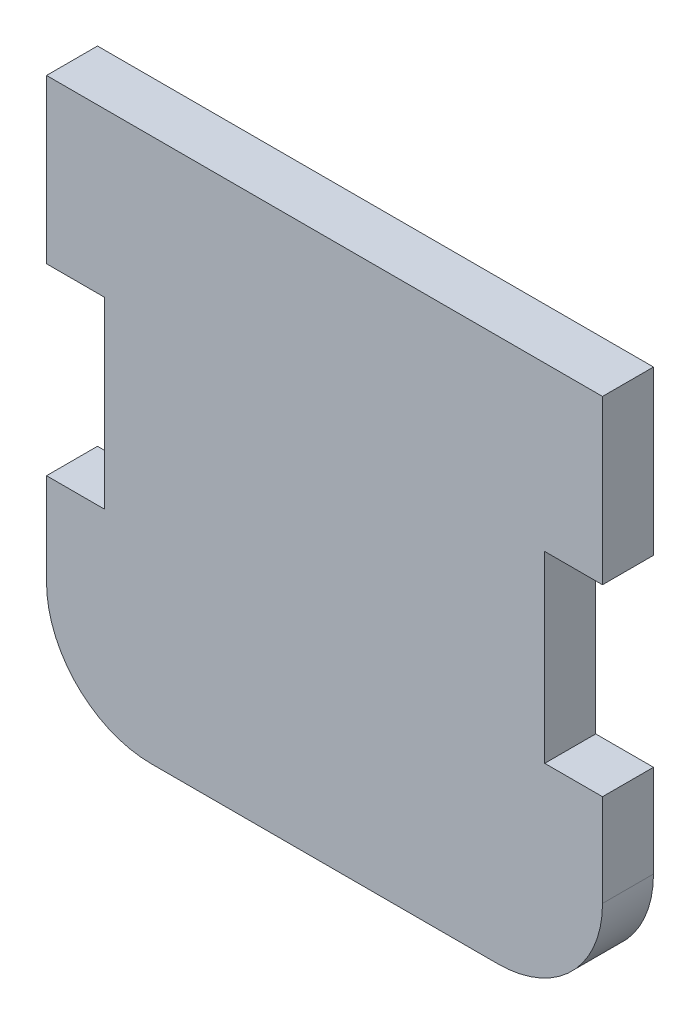
ISO-10303-21;
HEADER;
FILE_DESCRIPTION(('STEP AP214'),'2;1');
FILE_NAME('part.step','',(''),(''),'','','');
FILE_SCHEMA(('AUTOMOTIVE_DESIGN { 1 0 10303 214 1 1 1 1 }'));
ENDSEC;
DATA;
#1=APPLICATION_CONTEXT('core data for automotive mechanical design processes');
#2=APPLICATION_PROTOCOL_DEFINITION('international standard','automotive_design',2000,#1);
#3=PRODUCT_CONTEXT('',#1,'mechanical');
#4=PRODUCT('Part','Part','',(#3));
#5=PRODUCT_RELATED_PRODUCT_CATEGORY('part','',(#4));
#6=PRODUCT_DEFINITION_FORMATION('','',#4);
#7=PRODUCT_DEFINITION_CONTEXT('part definition',#1,'design');
#8=PRODUCT_DEFINITION('design','',#6,#7);
#9=PRODUCT_DEFINITION_SHAPE('','',#8);
#10=(LENGTH_UNIT() NAMED_UNIT(*) SI_UNIT(.MILLI.,.METRE.));
#11=(NAMED_UNIT(*) PLANE_ANGLE_UNIT() SI_UNIT($,.RADIAN.));
#12=(NAMED_UNIT(*) SI_UNIT($,.STERADIAN.) SOLID_ANGLE_UNIT());
#13=UNCERTAINTY_MEASURE_WITH_UNIT(LENGTH_MEASURE(1.E-05),#10,'distance_accuracy_value','');
#14=(GEOMETRIC_REPRESENTATION_CONTEXT(3) GLOBAL_UNCERTAINTY_ASSIGNED_CONTEXT((#13)) GLOBAL_UNIT_ASSIGNED_CONTEXT((#10,
#11,#12)) REPRESENTATION_CONTEXT('',''));
#15=CARTESIAN_POINT('',(0.,0.,0.));
#16=DIRECTION('',(0.,0.,1.));
#17=DIRECTION('',(1.,0.,0.));
#18=AXIS2_PLACEMENT_3D('',#15,#16,#17);
#19=CARTESIAN_POINT('',(-432.2699,-6.09600000000011,1.905));
#20=DIRECTION('',(0.,1.,0.));
#21=DIRECTION('',(-1.,0.,0.));
#22=AXIS2_PLACEMENT_3D('',#19,#20,#21);
#23=PLANE('',#22);
#24=DIRECTION('',(0.,0.,1.));
#25=VECTOR('',#24,1.);
#26=CARTESIAN_POINT('',(-434.6829,-6.09600000000011,1.905));
#27=LINE('',#26,#25);
#28=CARTESIAN_POINT('',(-434.6829,-6.09600000000011,0.));
#29=VERTEX_POINT('',#28);
#30=CARTESIAN_POINT('',(-434.6829,-6.09600000000011,1.905));
#31=VERTEX_POINT('',#30);
#32=EDGE_CURVE('E11',#29,#31,#27,.T.);
#33=ORIENTED_EDGE('',*,*,#32,.F.);
#34=DIRECTION('',(1.,0.,0.));
#35=VECTOR('',#34,1.);
#36=CARTESIAN_POINT('',(-436.4355,-6.09600000000011,0.));
#37=LINE('',#36,#35);
#38=CARTESIAN_POINT('',(-432.5239,-6.09600000000011,0.));
#39=VERTEX_POINT('',#38);
#40=EDGE_CURVE('E136',#39,#29,#37,.F.);
#41=ORIENTED_EDGE('',*,*,#40,.F.);
#42=DIRECTION('',(0.,0.,1.));
#43=VECTOR('',#42,1.);
#44=CARTESIAN_POINT('',(-432.5239,-6.09600000000011,1.905));
#45=LINE('',#44,#43);
#46=CARTESIAN_POINT('',(-432.5239,-6.09600000000011,1.905));
#47=VERTEX_POINT('',#46);
#48=EDGE_CURVE('E60',#39,#47,#45,.T.);
#49=ORIENTED_EDGE('',*,*,#48,.T.);
#50=DIRECTION('',(-1.,0.,0.));
#51=VECTOR('',#50,1.);
#52=CARTESIAN_POINT('',(-432.2699,-6.09600000000011,1.905));
#53=LINE('',#52,#51);
#54=EDGE_CURVE('E240',#47,#31,#53,.T.);
#55=ORIENTED_EDGE('',*,*,#54,.T.);
#56=EDGE_LOOP('',(#33,#41,#49,#55));
#57=FACE_BOUND('',#56,.T.);
#58=ADVANCED_FACE('F49',(#57),#23,.F.);
#59=CARTESIAN_POINT('',(-432.5239,-1.11022302462516E-13,1.905));
#60=DIRECTION('',(-1.,0.,0.));
#61=DIRECTION('',(0.,-1.,0.));
#62=AXIS2_PLACEMENT_3D('',#59,#60,#61);
#63=PLANE('',#62);
#64=ORIENTED_EDGE('',*,*,#48,.F.);
#65=DIRECTION('',(0.,1.,0.));
#66=VECTOR('',#65,1.);
#67=CARTESIAN_POINT('',(-432.5239,-16.4084000000001,0.));
#68=LINE('',#67,#66);
#69=CARTESIAN_POINT('',(-432.5239,-1.11022302462516E-13,0.));
#70=VERTEX_POINT('',#69);
#71=EDGE_CURVE('E188',#70,#39,#68,.F.);
#72=ORIENTED_EDGE('',*,*,#71,.F.);
#73=DIRECTION('',(0.,0.,1.));
#74=VECTOR('',#73,1.);
#75=CARTESIAN_POINT('',(-432.5239,-1.11022302462516E-13,1.905));
#76=LINE('',#75,#74);
#77=CARTESIAN_POINT('',(-432.5239,-1.11022302462516E-13,1.905));
#78=VERTEX_POINT('',#77);
#79=EDGE_CURVE('E229',#70,#78,#76,.T.);
#80=ORIENTED_EDGE('',*,*,#79,.T.);
#81=DIRECTION('',(0.,-1.,0.));
#82=VECTOR('',#81,1.);
#83=CARTESIAN_POINT('',(-432.5239,-1.11022302462516E-13,1.905));
#84=LINE('',#83,#82);
#85=EDGE_CURVE('E250',#78,#47,#84,.T.);
#86=ORIENTED_EDGE('',*,*,#85,.T.);
#87=EDGE_LOOP('',(#64,#72,#80,#86));
#88=FACE_BOUND('',#87,.T.);
#89=ADVANCED_FACE('F254',(#88),#63,.F.);
#90=CARTESIAN_POINT('',(-451.396099999999,-1.11022302462516E-13,1.905));
#91=DIRECTION('',(0.,-1.,0.));
#92=DIRECTION('',(1.,0.,0.));
#93=AXIS2_PLACEMENT_3D('',#90,#91,#92);
#94=PLANE('',#93);
#95=ORIENTED_EDGE('',*,*,#79,.F.);
#96=DIRECTION('',(1.,0.,0.));
#97=VECTOR('',#96,1.);
#98=CARTESIAN_POINT('',(-436.4355,-1.11022302462516E-13,0.));
#99=LINE('',#98,#97);
#100=CARTESIAN_POINT('',(-453.301099999999,-1.11022302462516E-13,0.));
#101=VERTEX_POINT('',#100);
#102=EDGE_CURVE('E184',#101,#70,#99,.T.);
#103=ORIENTED_EDGE('',*,*,#102,.F.);
#104=DIRECTION('',(0.,0.,1.));
#105=VECTOR('',#104,1.);
#106=CARTESIAN_POINT('',(-453.301099999999,-1.11022302462516E-13,1.905));
#107=LINE('',#106,#105);
#108=CARTESIAN_POINT('',(-453.301099999999,-1.11022302462516E-13,1.905));
#109=VERTEX_POINT('',#108);
#110=EDGE_CURVE('E225',#101,#109,#107,.T.);
#111=ORIENTED_EDGE('',*,*,#110,.T.);
#112=DIRECTION('',(1.,0.,0.));
#113=VECTOR('',#112,1.);
#114=CARTESIAN_POINT('',(-451.396099999999,-1.11022302462516E-13,1.905));
#115=LINE('',#114,#113);
#116=EDGE_CURVE('E256',#109,#78,#115,.T.);
#117=ORIENTED_EDGE('',*,*,#116,.T.);
#118=EDGE_LOOP('',(#95,#103,#111,#117));
#119=FACE_BOUND('',#118,.T.);
#120=ADVANCED_FACE('F334',(#119),#94,.F.);
#121=CARTESIAN_POINT('',(-453.301099999999,-16.4084000000001,1.905));
#122=DIRECTION('',(1.,0.,0.));
#123=DIRECTION('',(0.,1.,0.));
#124=AXIS2_PLACEMENT_3D('',#121,#122,#123);
#125=PLANE('',#124);
#126=ORIENTED_EDGE('',*,*,#110,.F.);
#127=DIRECTION('',(0.,1.,0.));
#128=VECTOR('',#127,1.);
#129=CARTESIAN_POINT('',(-453.301099999999,-16.4084000000001,0.));
#130=LINE('',#129,#128);
#131=CARTESIAN_POINT('',(-453.301099999999,-6.09600000000011,0.));
#132=VERTEX_POINT('',#131);
#133=EDGE_CURVE('E180',#132,#101,#130,.T.);
#134=ORIENTED_EDGE('',*,*,#133,.F.);
#135=DIRECTION('',(0.,0.,1.));
#136=VECTOR('',#135,1.);
#137=CARTESIAN_POINT('',(-453.301099999999,-6.09600000000011,1.905));
#138=LINE('',#137,#136);
#139=CARTESIAN_POINT('',(-453.301099999999,-6.09600000000011,1.905));
#140=VERTEX_POINT('',#139);
#141=EDGE_CURVE('E221',#132,#140,#138,.T.);
#142=ORIENTED_EDGE('',*,*,#141,.T.);
#143=DIRECTION('',(0.,1.,0.));
#144=VECTOR('',#143,1.);
#145=CARTESIAN_POINT('',(-453.301099999999,-16.4084000000001,1.905));
#146=LINE('',#145,#144);
#147=EDGE_CURVE('E260',#140,#109,#146,.T.);
#148=ORIENTED_EDGE('',*,*,#147,.T.);
#149=EDGE_LOOP('',(#126,#134,#142,#148));
#150=FACE_BOUND('',#149,.T.);
#151=ADVANCED_FACE('F352',(#150),#125,.F.);
#152=CARTESIAN_POINT('',(-453.555099999999,-6.09600000000011,1.905));
#153=DIRECTION('',(0.,1.,0.));
#154=DIRECTION('',(-1.,0.,0.));
#155=AXIS2_PLACEMENT_3D('',#152,#153,#154);
#156=PLANE('',#155);
#157=ORIENTED_EDGE('',*,*,#141,.F.);
#158=DIRECTION('',(1.,0.,0.));
#159=VECTOR('',#158,1.);
#160=CARTESIAN_POINT('',(-436.4355,-6.09600000000011,0.));
#161=LINE('',#160,#159);
#162=CARTESIAN_POINT('',(-451.142099999999,-6.09600000000011,0.));
#163=VERTEX_POINT('',#162);
#164=EDGE_CURVE('E176',#163,#132,#161,.F.);
#165=ORIENTED_EDGE('',*,*,#164,.F.);
#166=DIRECTION('',(0.,0.,1.));
#167=VECTOR('',#166,1.);
#168=CARTESIAN_POINT('',(-451.142099999999,-6.09600000000011,1.905));
#169=LINE('',#168,#167);
#170=CARTESIAN_POINT('',(-451.142099999999,-6.09600000000011,1.905));
#171=VERTEX_POINT('',#170);
#172=EDGE_CURVE('E217',#163,#171,#169,.T.);
#173=ORIENTED_EDGE('',*,*,#172,.T.);
#174=DIRECTION('',(-1.,0.,0.));
#175=VECTOR('',#174,1.);
#176=CARTESIAN_POINT('',(-453.555099999999,-6.09600000000011,1.905));
#177=LINE('',#176,#175);
#178=EDGE_CURVE('E289',#171,#140,#177,.T.);
#179=ORIENTED_EDGE('',*,*,#178,.T.);
#180=EDGE_LOOP('',(#157,#165,#173,#179));
#181=FACE_BOUND('',#180,.T.);
#182=ADVANCED_FACE('F338',(#181),#156,.F.);
#183=CARTESIAN_POINT('',(-451.142099999999,-12.9540000000001,1.905));
#184=DIRECTION('',(1.,0.,0.));
#185=DIRECTION('',(0.,1.,0.));
#186=AXIS2_PLACEMENT_3D('',#183,#184,#185);
#187=PLANE('',#186);
#188=ORIENTED_EDGE('',*,*,#172,.F.);
#189=DIRECTION('',(0.,1.,0.));
#190=VECTOR('',#189,1.);
#191=CARTESIAN_POINT('',(-451.142099999999,-16.4084000000001,0.));
#192=LINE('',#191,#190);
#193=CARTESIAN_POINT('',(-451.142099999999,-12.9540000000001,0.));
#194=VERTEX_POINT('',#193);
#195=EDGE_CURVE('E172',#194,#163,#192,.T.);
#196=ORIENTED_EDGE('',*,*,#195,.F.);
#197=DIRECTION('',(0.,0.,1.));
#198=VECTOR('',#197,1.);
#199=CARTESIAN_POINT('',(-451.142099999999,-12.9540000000001,1.905));
#200=LINE('',#199,#198);
#201=CARTESIAN_POINT('',(-451.142099999999,-12.9540000000001,1.905));
#202=VERTEX_POINT('',#201);
#203=EDGE_CURVE('E213',#194,#202,#200,.T.);
#204=ORIENTED_EDGE('',*,*,#203,.T.);
#205=DIRECTION('',(0.,1.,0.));
#206=VECTOR('',#205,1.);
#207=CARTESIAN_POINT('',(-451.142099999999,-12.9540000000001,1.905));
#208=LINE('',#207,#206);
#209=EDGE_CURVE('E285',#202,#171,#208,.T.);
#210=ORIENTED_EDGE('',*,*,#209,.T.);
#211=EDGE_LOOP('',(#188,#196,#204,#210));
#212=FACE_BOUND('',#211,.T.);
#213=ADVANCED_FACE('F342',(#212),#187,.F.);
#214=CARTESIAN_POINT('',(-453.555099999999,-12.9540000000001,1.905));
#215=DIRECTION('',(0.,-1.,0.));
#216=DIRECTION('',(1.,0.,0.));
#217=AXIS2_PLACEMENT_3D('',#214,#215,#216);
#218=PLANE('',#217);
#219=ORIENTED_EDGE('',*,*,#203,.F.);
#220=DIRECTION('',(1.,0.,0.));
#221=VECTOR('',#220,1.);
#222=CARTESIAN_POINT('',(-436.4355,-12.9540000000001,0.));
#223=LINE('',#222,#221);
#224=CARTESIAN_POINT('',(-453.301099999999,-12.9540000000001,0.));
#225=VERTEX_POINT('',#224);
#226=EDGE_CURVE('E168',#225,#194,#223,.T.);
#227=ORIENTED_EDGE('',*,*,#226,.F.);
#228=DIRECTION('',(0.,0.,1.));
#229=VECTOR('',#228,1.);
#230=CARTESIAN_POINT('',(-453.301099999999,-12.9540000000001,1.905));
#231=LINE('',#230,#229);
#232=CARTESIAN_POINT('',(-453.301099999999,-12.9540000000001,1.905));
#233=VERTEX_POINT('',#232);
#234=EDGE_CURVE('E209',#225,#233,#231,.T.);
#235=ORIENTED_EDGE('',*,*,#234,.T.);
#236=DIRECTION('',(1.,0.,0.));
#237=VECTOR('',#236,1.);
#238=CARTESIAN_POINT('',(-453.555099999999,-12.9540000000001,1.905));
#239=LINE('',#238,#237);
#240=EDGE_CURVE('E281',#233,#202,#239,.T.);
#241=ORIENTED_EDGE('',*,*,#240,.T.);
#242=EDGE_LOOP('',(#219,#227,#235,#241));
#243=FACE_BOUND('',#242,.T.);
#244=ADVANCED_FACE('F345',(#243),#218,.F.);
#245=ORIENTED_EDGE('',*,*,#234,.F.);
#246=DIRECTION('',(0.,1.,0.));
#247=VECTOR('',#246,1.);
#248=CARTESIAN_POINT('',(-453.301099999999,-16.4084000000001,0.));
#249=LINE('',#248,#247);
#250=CARTESIAN_POINT('',(-453.301099999999,-16.4084000000001,0.));
#251=VERTEX_POINT('',#250);
#252=EDGE_CURVE('E164',#251,#225,#249,.T.);
#253=ORIENTED_EDGE('',*,*,#252,.F.);
#254=DIRECTION('',(0.,0.,1.));
#255=VECTOR('',#254,1.);
#256=CARTESIAN_POINT('',(-453.301099999999,-16.4084000000001,1.905));
#257=LINE('',#256,#255);
#258=CARTESIAN_POINT('',(-453.301099999999,-16.4084000000001,1.905));
#259=VERTEX_POINT('',#258);
#260=EDGE_CURVE('E205',#251,#259,#257,.T.);
#261=ORIENTED_EDGE('',*,*,#260,.T.);
#262=EDGE_CURVE('E278',#259,#233,#146,.T.);
#263=ORIENTED_EDGE('',*,*,#262,.T.);
#264=EDGE_LOOP('',(#245,#253,#261,#263));
#265=FACE_BOUND('',#264,.T.);
#266=ADVANCED_FACE('F305',(#265),#125,.F.);
#267=CARTESIAN_POINT('',(-449.389499999999,-16.4084000000001,1.905));
#268=DIRECTION('',(0.,0.,1.));
#269=DIRECTION('',(1.,0.,0.));
#270=AXIS2_PLACEMENT_3D('',#267,#268,#269);
#271=CYLINDRICAL_SURFACE('',#270,3.91160000000002);
#272=ORIENTED_EDGE('',*,*,#260,.F.);
#273=CARTESIAN_POINT('',(-449.389499999999,-16.4084000000001,0.));
#274=DIRECTION('',(0.,0.,1.));
#275=DIRECTION('',(1.,0.,0.));
#276=AXIS2_PLACEMENT_3D('',#273,#274,#275);
#277=CIRCLE('',#276,3.91160000000002);
#278=CARTESIAN_POINT('',(-449.389499999999,-20.3200000000001,0.));
#279=VERTEX_POINT('',#278);
#280=EDGE_CURVE('E160',#251,#279,#277,.T.);
#281=ORIENTED_EDGE('',*,*,#280,.T.);
#282=DIRECTION('',(0.,0.,1.));
#283=VECTOR('',#282,1.);
#284=CARTESIAN_POINT('',(-449.389499999999,-20.3200000000001,1.905));
#285=LINE('',#284,#283);
#286=CARTESIAN_POINT('',(-449.389499999999,-20.3200000000001,1.905));
#287=VERTEX_POINT('',#286);
#288=EDGE_CURVE('E201',#279,#287,#285,.T.);
#289=ORIENTED_EDGE('',*,*,#288,.T.);
#290=CARTESIAN_POINT('',(-449.389499999999,-16.4084000000001,1.905));
#291=DIRECTION('',(0.,0.,1.));
#292=DIRECTION('',(1.,0.,0.));
#293=AXIS2_PLACEMENT_3D('',#290,#291,#292);
#294=CIRCLE('',#293,3.91160000000002);
#295=EDGE_CURVE('E272',#259,#287,#294,.T.);
#296=ORIENTED_EDGE('',*,*,#295,.F.);
#297=EDGE_LOOP('',(#272,#281,#289,#296));
#298=FACE_BOUND('',#297,.T.);
#299=ADVANCED_FACE('F315',(#298),#271,.T.);
#300=CARTESIAN_POINT('',(-436.4355,-20.3200000000001,1.905));
#301=DIRECTION('',(0.,1.,0.));
#302=DIRECTION('',(-1.,0.,0.));
#303=AXIS2_PLACEMENT_3D('',#300,#301,#302);
#304=PLANE('',#303);
#305=ORIENTED_EDGE('',*,*,#288,.F.);
#306=DIRECTION('',(1.,0.,0.));
#307=VECTOR('',#306,1.);
#308=CARTESIAN_POINT('',(-436.4355,-20.3200000000001,0.));
#309=LINE('',#308,#307);
#310=CARTESIAN_POINT('',(-436.4355,-20.3200000000001,0.));
#311=VERTEX_POINT('',#310);
#312=EDGE_CURVE('E156',#311,#279,#309,.F.);
#313=ORIENTED_EDGE('',*,*,#312,.F.);
#314=DIRECTION('',(0.,0.,1.));
#315=VECTOR('',#314,1.);
#316=CARTESIAN_POINT('',(-436.4355,-20.3200000000001,1.905));
#317=LINE('',#316,#315);
#318=CARTESIAN_POINT('',(-436.4355,-20.3200000000001,1.905));
#319=VERTEX_POINT('',#318);
#320=EDGE_CURVE('E197',#311,#319,#317,.T.);
#321=ORIENTED_EDGE('',*,*,#320,.T.);
#322=DIRECTION('',(-1.,0.,0.));
#323=VECTOR('',#322,1.);
#324=CARTESIAN_POINT('',(-436.4355,-20.3200000000001,1.905));
#325=LINE('',#324,#323);
#326=EDGE_CURVE('E267',#319,#287,#325,.T.);
#327=ORIENTED_EDGE('',*,*,#326,.T.);
#328=EDGE_LOOP('',(#305,#313,#321,#327));
#329=FACE_BOUND('',#328,.T.);
#330=ADVANCED_FACE('F319',(#329),#304,.F.);
#331=CARTESIAN_POINT('',(-436.4355,-16.4084000000001,1.905));
#332=DIRECTION('',(0.,0.,1.));
#333=DIRECTION('',(1.,0.,0.));
#334=AXIS2_PLACEMENT_3D('',#331,#332,#333);
#335=CYLINDRICAL_SURFACE('',#334,3.91160000000002);
#336=ORIENTED_EDGE('',*,*,#320,.F.);
#337=CARTESIAN_POINT('',(-436.4355,-16.4084000000001,0.));
#338=DIRECTION('',(0.,0.,1.));
#339=DIRECTION('',(1.,0.,0.));
#340=AXIS2_PLACEMENT_3D('',#337,#338,#339);
#341=CIRCLE('',#340,3.91160000000002);
#342=CARTESIAN_POINT('',(-432.5239,-16.4084000000001,0.));
#343=VERTEX_POINT('',#342);
#344=EDGE_CURVE('E152',#311,#343,#341,.T.);
#345=ORIENTED_EDGE('',*,*,#344,.T.);
#346=DIRECTION('',(0.,0.,1.));
#347=VECTOR('',#346,1.);
#348=CARTESIAN_POINT('',(-432.5239,-16.4084000000001,1.905));
#349=LINE('',#348,#347);
#350=CARTESIAN_POINT('',(-432.5239,-16.4084000000001,1.905));
#351=VERTEX_POINT('',#350);
#352=EDGE_CURVE('E194',#343,#351,#349,.T.);
#353=ORIENTED_EDGE('',*,*,#352,.T.);
#354=CARTESIAN_POINT('',(-436.4355,-16.4084000000001,1.905));
#355=DIRECTION('',(0.,0.,1.));
#356=DIRECTION('',(1.,0.,0.));
#357=AXIS2_PLACEMENT_3D('',#354,#355,#356);
#358=CIRCLE('',#357,3.91160000000002);
#359=EDGE_CURVE('E146',#319,#351,#358,.T.);
#360=ORIENTED_EDGE('',*,*,#359,.F.);
#361=EDGE_LOOP('',(#336,#345,#353,#360));
#362=FACE_BOUND('',#361,.T.);
#363=ADVANCED_FACE('F322',(#362),#335,.T.);
#364=ORIENTED_EDGE('',*,*,#352,.F.);
#365=DIRECTION('',(0.,1.,0.));
#366=VECTOR('',#365,1.);
#367=CARTESIAN_POINT('',(-432.5239,-16.4084000000001,0.));
#368=LINE('',#367,#366);
#369=CARTESIAN_POINT('',(-432.5239,-12.9540000000001,0.));
#370=VERTEX_POINT('',#369);
#371=EDGE_CURVE('E148',#370,#343,#368,.F.);
#372=ORIENTED_EDGE('',*,*,#371,.F.);
#373=DIRECTION('',(0.,0.,1.));
#374=VECTOR('',#373,1.);
#375=CARTESIAN_POINT('',(-432.5239,-12.9540000000001,1.905));
#376=LINE('',#375,#374);
#377=CARTESIAN_POINT('',(-432.5239,-12.9540000000001,1.905));
#378=VERTEX_POINT('',#377);
#379=EDGE_CURVE('E68',#370,#378,#376,.T.);
#380=ORIENTED_EDGE('',*,*,#379,.T.);
#381=EDGE_CURVE('E129',#378,#351,#84,.T.);
#382=ORIENTED_EDGE('',*,*,#381,.T.);
#383=EDGE_LOOP('',(#364,#372,#380,#382));
#384=FACE_BOUND('',#383,.T.);
#385=ADVANCED_FACE('F358',(#384),#63,.F.);
#386=CARTESIAN_POINT('',(-432.2699,-12.9540000000001,1.905));
#387=DIRECTION('',(0.,-1.,0.));
#388=DIRECTION('',(1.,0.,0.));
#389=AXIS2_PLACEMENT_3D('',#386,#387,#388);
#390=PLANE('',#389);
#391=ORIENTED_EDGE('',*,*,#379,.F.);
#392=DIRECTION('',(1.,0.,0.));
#393=VECTOR('',#392,1.);
#394=CARTESIAN_POINT('',(-436.4355,-12.9540000000001,0.));
#395=LINE('',#394,#393);
#396=CARTESIAN_POINT('',(-434.6829,-12.9540000000001,0.));
#397=VERTEX_POINT('',#396);
#398=EDGE_CURVE('E134',#397,#370,#395,.T.);
#399=ORIENTED_EDGE('',*,*,#398,.F.);
#400=DIRECTION('',(0.,0.,1.));
#401=VECTOR('',#400,1.);
#402=CARTESIAN_POINT('',(-434.6829,-12.9540000000001,1.905));
#403=LINE('',#402,#401);
#404=CARTESIAN_POINT('',(-434.6829,-12.9540000000001,1.905));
#405=VERTEX_POINT('',#404);
#406=EDGE_CURVE('E53',#397,#405,#403,.T.);
#407=ORIENTED_EDGE('',*,*,#406,.T.);
#408=DIRECTION('',(1.,0.,0.));
#409=VECTOR('',#408,1.);
#410=CARTESIAN_POINT('',(-432.2699,-12.9540000000001,1.905));
#411=LINE('',#410,#409);
#412=EDGE_CURVE('E151',#405,#378,#411,.T.);
#413=ORIENTED_EDGE('',*,*,#412,.T.);
#414=EDGE_LOOP('',(#391,#399,#407,#413));
#415=FACE_BOUND('',#414,.T.);
#416=ADVANCED_FACE('F139',(#415),#390,.F.);
#417=CARTESIAN_POINT('',(-434.6829,-12.9540000000001,1.905));
#418=DIRECTION('',(-1.,0.,0.));
#419=DIRECTION('',(0.,-1.,0.));
#420=AXIS2_PLACEMENT_3D('',#417,#418,#419);
#421=PLANE('',#420);
#422=DIRECTION('',(0.,1.,0.));
#423=VECTOR('',#422,1.);
#424=CARTESIAN_POINT('',(-434.6829,-16.4084000000001,0.));
#425=LINE('',#424,#423);
#426=EDGE_CURVE('E122',#29,#397,#425,.F.);
#427=ORIENTED_EDGE('',*,*,#426,.F.);
#428=ORIENTED_EDGE('',*,*,#32,.T.);
#429=DIRECTION('',(0.,-1.,0.));
#430=VECTOR('',#429,1.);
#431=CARTESIAN_POINT('',(-434.6829,-12.9540000000001,1.905));
#432=LINE('',#431,#430);
#433=EDGE_CURVE('E124',#31,#405,#432,.T.);
#434=ORIENTED_EDGE('',*,*,#433,.T.);
#435=ORIENTED_EDGE('',*,*,#406,.F.);
#436=EDGE_LOOP('',(#427,#428,#434,#435));
#437=FACE_BOUND('',#436,.T.);
#438=ADVANCED_FACE('F51',(#437),#421,.F.);
#439=CARTESIAN_POINT('',(-436.4355,-16.4084000000001,1.905));
#440=DIRECTION('',(0.,0.,1.));
#441=DIRECTION('',(1.,0.,0.));
#442=AXIS2_PLACEMENT_3D('',#439,#440,#441);
#443=PLANE('',#442);
#444=ORIENTED_EDGE('',*,*,#412,.F.);
#445=ORIENTED_EDGE('',*,*,#433,.F.);
#446=ORIENTED_EDGE('',*,*,#54,.F.);
#447=ORIENTED_EDGE('',*,*,#85,.F.);
#448=ORIENTED_EDGE('',*,*,#116,.F.);
#449=ORIENTED_EDGE('',*,*,#147,.F.);
#450=ORIENTED_EDGE('',*,*,#178,.F.);
#451=ORIENTED_EDGE('',*,*,#209,.F.);
#452=ORIENTED_EDGE('',*,*,#240,.F.);
#453=ORIENTED_EDGE('',*,*,#262,.F.);
#454=ORIENTED_EDGE('',*,*,#295,.T.);
#455=ORIENTED_EDGE('',*,*,#326,.F.);
#456=ORIENTED_EDGE('',*,*,#359,.T.);
#457=ORIENTED_EDGE('',*,*,#381,.F.);
#458=EDGE_LOOP('',(#444,#445,#446,#447,#448,#449,#450,#451,#452,#453,#454,#455,#456,#457));
#459=FACE_BOUND('',#458,.T.);
#460=ADVANCED_FACE('F248',(#459),#443,.T.);
#461=CARTESIAN_POINT('',(-436.4355,-16.4084000000001,0.));
#462=DIRECTION('',(0.,0.,1.));
#463=DIRECTION('',(1.,0.,0.));
#464=AXIS2_PLACEMENT_3D('',#461,#462,#463);
#465=PLANE('',#464);
#466=ORIENTED_EDGE('',*,*,#398,.T.);
#467=ORIENTED_EDGE('',*,*,#371,.T.);
#468=ORIENTED_EDGE('',*,*,#344,.F.);
#469=ORIENTED_EDGE('',*,*,#312,.T.);
#470=ORIENTED_EDGE('',*,*,#280,.F.);
#471=ORIENTED_EDGE('',*,*,#252,.T.);
#472=ORIENTED_EDGE('',*,*,#226,.T.);
#473=ORIENTED_EDGE('',*,*,#195,.T.);
#474=ORIENTED_EDGE('',*,*,#164,.T.);
#475=ORIENTED_EDGE('',*,*,#133,.T.);
#476=ORIENTED_EDGE('',*,*,#102,.T.);
#477=ORIENTED_EDGE('',*,*,#71,.T.);
#478=ORIENTED_EDGE('',*,*,#40,.T.);
#479=ORIENTED_EDGE('',*,*,#426,.T.);
#480=EDGE_LOOP('',(#466,#467,#468,#469,#470,#471,#472,#473,#474,#475,#476,#477,#478,#479));
#481=FACE_BOUND('',#480,.T.);
#482=ADVANCED_FACE('F132',(#481),#465,.F.);
#483=CLOSED_SHELL('',(#58,#89,#120,#151,#182,#213,#244,#266,#299,#330,#363,#385,#416,#438,#460,#482));
#484=MANIFOLD_SOLID_BREP('B2',#483);
#485=ADVANCED_BREP_SHAPE_REPRESENTATION('',(#18,#484),#14);
#486=SHAPE_DEFINITION_REPRESENTATION(#9,#485);
ENDSEC;
END-ISO-10303-21;
